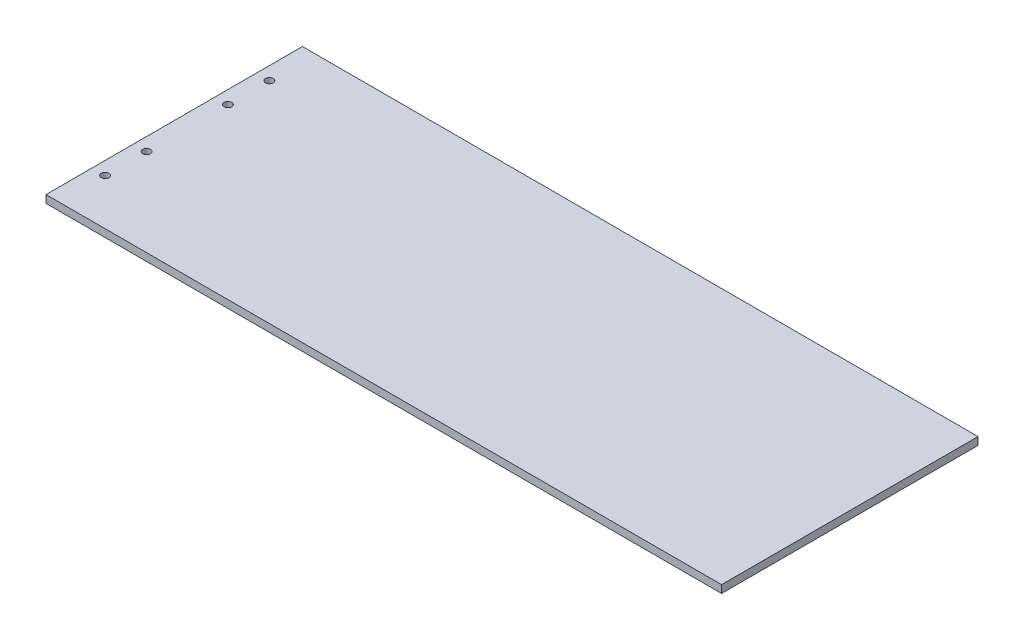
ISO-10303-21;
HEADER;
FILE_DESCRIPTION(('STEP AP214'),'2;1');
FILE_NAME('part.step','',(''),(''),'','','');
FILE_SCHEMA(('AUTOMOTIVE_DESIGN { 1 0 10303 214 1 1 1 1 }'));
ENDSEC;
DATA;
#1=APPLICATION_CONTEXT('core data for automotive mechanical design processes');
#2=APPLICATION_PROTOCOL_DEFINITION('international standard','automotive_design',2000,#1);
#3=PRODUCT_CONTEXT('',#1,'mechanical');
#4=PRODUCT('Part','Part','',(#3));
#5=PRODUCT_RELATED_PRODUCT_CATEGORY('part','',(#4));
#6=PRODUCT_DEFINITION_FORMATION('','',#4);
#7=PRODUCT_DEFINITION_CONTEXT('part definition',#1,'design');
#8=PRODUCT_DEFINITION('design','',#6,#7);
#9=PRODUCT_DEFINITION_SHAPE('','',#8);
#10=(LENGTH_UNIT() NAMED_UNIT(*) SI_UNIT(.MILLI.,.METRE.));
#11=(NAMED_UNIT(*) PLANE_ANGLE_UNIT() SI_UNIT($,.RADIAN.));
#12=(NAMED_UNIT(*) SI_UNIT($,.STERADIAN.) SOLID_ANGLE_UNIT());
#13=UNCERTAINTY_MEASURE_WITH_UNIT(LENGTH_MEASURE(1.E-05),#10,'distance_accuracy_value','');
#14=(GEOMETRIC_REPRESENTATION_CONTEXT(3) GLOBAL_UNCERTAINTY_ASSIGNED_CONTEXT((#13)) GLOBAL_UNIT_ASSIGNED_CONTEXT((#10,
#11,#12)) REPRESENTATION_CONTEXT('',''));
#15=CARTESIAN_POINT('',(0.,0.,0.));
#16=DIRECTION('',(0.,0.,1.));
#17=DIRECTION('',(1.,0.,0.));
#18=AXIS2_PLACEMENT_3D('',#15,#16,#17);
#19=CARTESIAN_POINT('',(-220.,5.,-83.5));
#20=DIRECTION('',(1.,0.,0.));
#21=DIRECTION('',(0.,0.,-1.));
#22=AXIS2_PLACEMENT_3D('',#19,#20,#21);
#23=PLANE('',#22);
#24=DIRECTION('',(0.,0.,1.));
#25=VECTOR('',#24,1.);
#26=CARTESIAN_POINT('',(-220.,0.,-83.5));
#27=LINE('',#26,#25);
#28=CARTESIAN_POINT('',(-220.,0.,-83.5));
#29=VERTEX_POINT('',#28);
#30=CARTESIAN_POINT('',(-220.,0.,83.5));
#31=VERTEX_POINT('',#30);
#32=EDGE_CURVE('E80',#29,#31,#27,.T.);
#33=ORIENTED_EDGE('',*,*,#32,.T.);
#34=DIRECTION('',(0.,-1.,0.));
#35=VECTOR('',#34,1.);
#36=CARTESIAN_POINT('',(-220.,5.,83.5));
#37=LINE('',#36,#35);
#38=CARTESIAN_POINT('',(-220.,5.,83.5));
#39=VERTEX_POINT('',#38);
#40=EDGE_CURVE('E11',#39,#31,#37,.T.);
#41=ORIENTED_EDGE('',*,*,#40,.F.);
#42=DIRECTION('',(0.,0.,1.));
#43=VECTOR('',#42,1.);
#44=CARTESIAN_POINT('',(-220.,5.,-83.5));
#45=LINE('',#44,#43);
#46=CARTESIAN_POINT('',(-220.,5.,-83.5));
#47=VERTEX_POINT('',#46);
#48=EDGE_CURVE('E68',#47,#39,#45,.T.);
#49=ORIENTED_EDGE('',*,*,#48,.F.);
#50=DIRECTION('',(0.,-1.,0.));
#51=VECTOR('',#50,1.);
#52=CARTESIAN_POINT('',(-220.,5.,-83.5));
#53=LINE('',#52,#51);
#54=EDGE_CURVE('E76',#47,#29,#53,.T.);
#55=ORIENTED_EDGE('',*,*,#54,.T.);
#56=EDGE_LOOP('',(#33,#41,#49,#55));
#57=FACE_BOUND('',#56,.T.);
#58=ADVANCED_FACE('F17',(#57),#23,.F.);
#59=CARTESIAN_POINT('',(220.,5.,83.5));
#60=DIRECTION('',(0.,0.,-1.));
#61=DIRECTION('',(-1.,0.,0.));
#62=AXIS2_PLACEMENT_3D('',#59,#60,#61);
#63=PLANE('',#62);
#64=DIRECTION('',(1.,0.,0.));
#65=VECTOR('',#64,1.);
#66=CARTESIAN_POINT('',(220.,0.,83.5));
#67=LINE('',#66,#65);
#68=CARTESIAN_POINT('',(220.,0.,83.5));
#69=VERTEX_POINT('',#68);
#70=EDGE_CURVE('E72',#31,#69,#67,.T.);
#71=ORIENTED_EDGE('',*,*,#70,.T.);
#72=DIRECTION('',(0.,-1.,0.));
#73=VECTOR('',#72,1.);
#74=CARTESIAN_POINT('',(220.,5.,83.5));
#75=LINE('',#74,#73);
#76=CARTESIAN_POINT('',(220.,5.,83.5));
#77=VERTEX_POINT('',#76);
#78=EDGE_CURVE('E25',#77,#69,#75,.T.);
#79=ORIENTED_EDGE('',*,*,#78,.F.);
#80=DIRECTION('',(1.,0.,0.));
#81=VECTOR('',#80,1.);
#82=CARTESIAN_POINT('',(220.,5.,83.5));
#83=LINE('',#82,#81);
#84=EDGE_CURVE('E63',#39,#77,#83,.T.);
#85=ORIENTED_EDGE('',*,*,#84,.F.);
#86=ORIENTED_EDGE('',*,*,#40,.T.);
#87=EDGE_LOOP('',(#71,#79,#85,#86));
#88=FACE_BOUND('',#87,.T.);
#89=ADVANCED_FACE('F71',(#88),#63,.F.);
#90=CARTESIAN_POINT('',(220.,5.,-83.5));
#91=DIRECTION('',(-1.,0.,0.));
#92=DIRECTION('',(0.,0.,1.));
#93=AXIS2_PLACEMENT_3D('',#90,#91,#92);
#94=PLANE('',#93);
#95=DIRECTION('',(0.,0.,-1.));
#96=VECTOR('',#95,1.);
#97=CARTESIAN_POINT('',(220.,0.,-83.5));
#98=LINE('',#97,#96);
#99=CARTESIAN_POINT('',(220.,0.,-83.5));
#100=VERTEX_POINT('',#99);
#101=EDGE_CURVE('E50',#69,#100,#98,.T.);
#102=ORIENTED_EDGE('',*,*,#101,.T.);
#103=DIRECTION('',(0.,-1.,0.));
#104=VECTOR('',#103,1.);
#105=CARTESIAN_POINT('',(220.,5.,-83.5));
#106=LINE('',#105,#104);
#107=CARTESIAN_POINT('',(220.,5.,-83.5));
#108=VERTEX_POINT('',#107);
#109=EDGE_CURVE('E73',#108,#100,#106,.T.);
#110=ORIENTED_EDGE('',*,*,#109,.F.);
#111=DIRECTION('',(0.,0.,-1.));
#112=VECTOR('',#111,1.);
#113=CARTESIAN_POINT('',(220.,5.,-83.5));
#114=LINE('',#113,#112);
#115=EDGE_CURVE('E66',#77,#108,#114,.T.);
#116=ORIENTED_EDGE('',*,*,#115,.F.);
#117=ORIENTED_EDGE('',*,*,#78,.T.);
#118=EDGE_LOOP('',(#102,#110,#116,#117));
#119=FACE_BOUND('',#118,.T.);
#120=ADVANCED_FACE('F74',(#119),#94,.F.);
#121=CARTESIAN_POINT('',(220.,5.,-83.5));
#122=DIRECTION('',(0.,0.,1.));
#123=DIRECTION('',(1.,0.,0.));
#124=AXIS2_PLACEMENT_3D('',#121,#122,#123);
#125=PLANE('',#124);
#126=DIRECTION('',(-1.,0.,0.));
#127=VECTOR('',#126,1.);
#128=CARTESIAN_POINT('',(220.,0.,-83.5));
#129=LINE('',#128,#127);
#130=EDGE_CURVE('E56',#100,#29,#129,.T.);
#131=ORIENTED_EDGE('',*,*,#130,.T.);
#132=ORIENTED_EDGE('',*,*,#54,.F.);
#133=DIRECTION('',(-1.,0.,0.));
#134=VECTOR('',#133,1.);
#135=CARTESIAN_POINT('',(220.,5.,-83.5));
#136=LINE('',#135,#134);
#137=EDGE_CURVE('E33',#108,#47,#136,.T.);
#138=ORIENTED_EDGE('',*,*,#137,.F.);
#139=ORIENTED_EDGE('',*,*,#109,.T.);
#140=EDGE_LOOP('',(#131,#132,#138,#139));
#141=FACE_BOUND('',#140,.T.);
#142=ADVANCED_FACE('F88',(#141),#125,.F.);
#143=CARTESIAN_POINT('',(0.,5.,0.));
#144=DIRECTION('',(0.,-1.,0.));
#145=DIRECTION('',(0.,0.,-1.));
#146=AXIS2_PLACEMENT_3D('',#143,#144,#145);
#147=PLANE('',#146);
#148=CARTESIAN_POINT('',(-211.5,5.,53.5));
#149=DIRECTION('',(0.,-1.,0.));
#150=DIRECTION('',(0.,0.,-1.));
#151=AXIS2_PLACEMENT_3D('',#148,#149,#150);
#152=CIRCLE('',#151,2.5);
#153=CARTESIAN_POINT('',(-211.5,5.,51.));
#154=VERTEX_POINT('',#153);
#155=EDGE_CURVE('E83',#154,#154,#152,.T.);
#156=ORIENTED_EDGE('',*,*,#155,.T.);
#157=EDGE_LOOP('',(#156));
#158=FACE_BOUND('',#157,.T.);
#159=CARTESIAN_POINT('',(-211.5,5.,-26.5));
#160=DIRECTION('',(0.,-1.,0.));
#161=DIRECTION('',(0.,0.,1.));
#162=AXIS2_PLACEMENT_3D('',#159,#160,#161);
#163=CIRCLE('',#162,2.5);
#164=CARTESIAN_POINT('',(-211.5,5.,-24.));
#165=VERTEX_POINT('',#164);
#166=EDGE_CURVE('E98',#165,#165,#163,.T.);
#167=ORIENTED_EDGE('',*,*,#166,.T.);
#168=EDGE_LOOP('',(#167));
#169=FACE_BOUND('',#168,.T.);
#170=CARTESIAN_POINT('',(-211.5,5.,-53.5));
#171=DIRECTION('',(0.,-1.,0.));
#172=DIRECTION('',(0.,0.,1.));
#173=AXIS2_PLACEMENT_3D('',#170,#171,#172);
#174=CIRCLE('',#173,2.5);
#175=CARTESIAN_POINT('',(-211.5,5.,-51.));
#176=VERTEX_POINT('',#175);
#177=EDGE_CURVE('E97',#176,#176,#174,.T.);
#178=ORIENTED_EDGE('',*,*,#177,.T.);
#179=EDGE_LOOP('',(#178));
#180=FACE_BOUND('',#179,.T.);
#181=CARTESIAN_POINT('',(-211.5,5.,26.5));
#182=DIRECTION('',(0.,-1.,0.));
#183=DIRECTION('',(0.,0.,-1.));
#184=AXIS2_PLACEMENT_3D('',#181,#182,#183);
#185=CIRCLE('',#184,2.5);
#186=CARTESIAN_POINT('',(-211.5,5.,24.));
#187=VERTEX_POINT('',#186);
#188=EDGE_CURVE('E104',#187,#187,#185,.T.);
#189=ORIENTED_EDGE('',*,*,#188,.T.);
#190=EDGE_LOOP('',(#189));
#191=FACE_BOUND('',#190,.T.);
#192=ORIENTED_EDGE('',*,*,#48,.T.);
#193=ORIENTED_EDGE('',*,*,#84,.T.);
#194=ORIENTED_EDGE('',*,*,#115,.T.);
#195=ORIENTED_EDGE('',*,*,#137,.T.);
#196=EDGE_LOOP('',(#192,#193,#194,#195));
#197=FACE_BOUND('',#196,.T.);
#198=ADVANCED_FACE('F64',(#158,#169,#180,#191,#197),#147,.F.);
#199=CARTESIAN_POINT('',(0.,0.,0.));
#200=DIRECTION('',(0.,-1.,0.));
#201=DIRECTION('',(0.,0.,-1.));
#202=AXIS2_PLACEMENT_3D('',#199,#200,#201);
#203=PLANE('',#202);
#204=CARTESIAN_POINT('',(-211.5,0.,53.5));
#205=DIRECTION('',(0.,-1.,0.));
#206=DIRECTION('',(0.,0.,-1.));
#207=AXIS2_PLACEMENT_3D('',#204,#205,#206);
#208=CIRCLE('',#207,2.5);
#209=CARTESIAN_POINT('',(-211.5,0.,51.));
#210=VERTEX_POINT('',#209);
#211=EDGE_CURVE('E107',#210,#210,#208,.T.);
#212=ORIENTED_EDGE('',*,*,#211,.F.);
#213=EDGE_LOOP('',(#212));
#214=FACE_BOUND('',#213,.T.);
#215=CARTESIAN_POINT('',(-211.5,0.,-26.5));
#216=DIRECTION('',(0.,-1.,0.));
#217=DIRECTION('',(0.,0.,1.));
#218=AXIS2_PLACEMENT_3D('',#215,#216,#217);
#219=CIRCLE('',#218,2.5);
#220=CARTESIAN_POINT('',(-211.5,0.,-24.));
#221=VERTEX_POINT('',#220);
#222=EDGE_CURVE('E108',#221,#221,#219,.T.);
#223=ORIENTED_EDGE('',*,*,#222,.F.);
#224=EDGE_LOOP('',(#223));
#225=FACE_BOUND('',#224,.T.);
#226=CARTESIAN_POINT('',(-211.5,0.,-53.5));
#227=DIRECTION('',(0.,-1.,0.));
#228=DIRECTION('',(0.,0.,1.));
#229=AXIS2_PLACEMENT_3D('',#226,#227,#228);
#230=CIRCLE('',#229,2.5);
#231=CARTESIAN_POINT('',(-211.5,0.,-51.));
#232=VERTEX_POINT('',#231);
#233=EDGE_CURVE('E94',#232,#232,#230,.T.);
#234=ORIENTED_EDGE('',*,*,#233,.F.);
#235=EDGE_LOOP('',(#234));
#236=FACE_BOUND('',#235,.T.);
#237=CARTESIAN_POINT('',(-211.5,0.,26.5));
#238=DIRECTION('',(0.,-1.,0.));
#239=DIRECTION('',(0.,0.,-1.));
#240=AXIS2_PLACEMENT_3D('',#237,#238,#239);
#241=CIRCLE('',#240,2.5);
#242=CARTESIAN_POINT('',(-211.5,0.,24.));
#243=VERTEX_POINT('',#242);
#244=EDGE_CURVE('E101',#243,#243,#241,.T.);
#245=ORIENTED_EDGE('',*,*,#244,.F.);
#246=EDGE_LOOP('',(#245));
#247=FACE_BOUND('',#246,.T.);
#248=ORIENTED_EDGE('',*,*,#32,.F.);
#249=ORIENTED_EDGE('',*,*,#130,.F.);
#250=ORIENTED_EDGE('',*,*,#101,.F.);
#251=ORIENTED_EDGE('',*,*,#70,.F.);
#252=EDGE_LOOP('',(#248,#249,#250,#251));
#253=FACE_BOUND('',#252,.T.);
#254=ADVANCED_FACE('F91',(#214,#225,#236,#247,#253),#203,.T.);
#255=CARTESIAN_POINT('',(-211.5,5.,26.5));
#256=DIRECTION('',(0.,-1.,0.));
#257=DIRECTION('',(0.,0.,-1.));
#258=AXIS2_PLACEMENT_3D('',#255,#256,#257);
#259=CYLINDRICAL_SURFACE('',#258,2.5);
#260=ORIENTED_EDGE('',*,*,#188,.F.);
#261=EDGE_LOOP('',(#260));
#262=FACE_BOUND('',#261,.T.);
#263=ORIENTED_EDGE('',*,*,#244,.T.);
#264=EDGE_LOOP('',(#263));
#265=FACE_BOUND('',#264,.T.);
#266=ADVANCED_FACE('F129',(#262,#265),#259,.F.);
#267=CARTESIAN_POINT('',(-211.5,5.,-53.5));
#268=DIRECTION('',(0.,-1.,0.));
#269=DIRECTION('',(0.,0.,-1.));
#270=AXIS2_PLACEMENT_3D('',#267,#268,#269);
#271=CYLINDRICAL_SURFACE('',#270,2.5);
#272=ORIENTED_EDGE('',*,*,#177,.F.);
#273=EDGE_LOOP('',(#272));
#274=FACE_BOUND('',#273,.T.);
#275=ORIENTED_EDGE('',*,*,#233,.T.);
#276=EDGE_LOOP('',(#275));
#277=FACE_BOUND('',#276,.T.);
#278=ADVANCED_FACE('F138',(#274,#277),#271,.F.);
#279=CARTESIAN_POINT('',(-211.5,5.,-26.5));
#280=DIRECTION('',(0.,-1.,0.));
#281=DIRECTION('',(0.,0.,-1.));
#282=AXIS2_PLACEMENT_3D('',#279,#280,#281);
#283=CYLINDRICAL_SURFACE('',#282,2.5);
#284=ORIENTED_EDGE('',*,*,#166,.F.);
#285=EDGE_LOOP('',(#284));
#286=FACE_BOUND('',#285,.T.);
#287=ORIENTED_EDGE('',*,*,#222,.T.);
#288=EDGE_LOOP('',(#287));
#289=FACE_BOUND('',#288,.T.);
#290=ADVANCED_FACE('F123',(#286,#289),#283,.F.);
#291=CARTESIAN_POINT('',(-211.5,5.,53.5));
#292=DIRECTION('',(0.,-1.,0.));
#293=DIRECTION('',(0.,0.,-1.));
#294=AXIS2_PLACEMENT_3D('',#291,#292,#293);
#295=CYLINDRICAL_SURFACE('',#294,2.5);
#296=ORIENTED_EDGE('',*,*,#155,.F.);
#297=EDGE_LOOP('',(#296));
#298=FACE_BOUND('',#297,.T.);
#299=ORIENTED_EDGE('',*,*,#211,.T.);
#300=EDGE_LOOP('',(#299));
#301=FACE_BOUND('',#300,.T.);
#302=ADVANCED_FACE('F120',(#298,#301),#295,.F.);
#303=CLOSED_SHELL('',(#58,#89,#120,#142,#198,#254,#266,#278,#290,#302));
#304=MANIFOLD_SOLID_BREP('B1',#303);
#305=ADVANCED_BREP_SHAPE_REPRESENTATION('',(#18,#304),#14);
#306=SHAPE_DEFINITION_REPRESENTATION(#9,#305);
ENDSEC;
END-ISO-10303-21;
